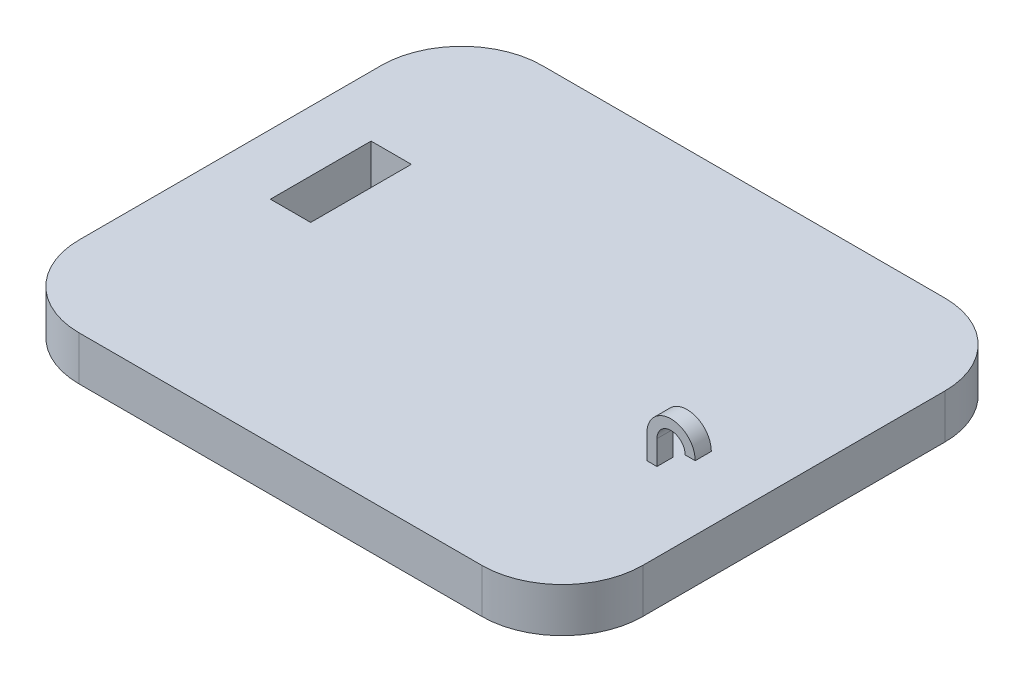
ISO-10303-21;
HEADER;
FILE_DESCRIPTION(('STEP AP214'),'2;1');
FILE_NAME('part.step','',(''),(''),'','','');
FILE_SCHEMA(('AUTOMOTIVE_DESIGN { 1 0 10303 214 1 1 1 1 }'));
ENDSEC;
DATA;
#1=APPLICATION_CONTEXT('core data for automotive mechanical design processes');
#2=APPLICATION_PROTOCOL_DEFINITION('international standard','automotive_design',2000,#1);
#3=PRODUCT_CONTEXT('',#1,'mechanical');
#4=PRODUCT('Part','Part','',(#3));
#5=PRODUCT_RELATED_PRODUCT_CATEGORY('part','',(#4));
#6=PRODUCT_DEFINITION_FORMATION('','',#4);
#7=PRODUCT_DEFINITION_CONTEXT('part definition',#1,'design');
#8=PRODUCT_DEFINITION('design','',#6,#7);
#9=PRODUCT_DEFINITION_SHAPE('','',#8);
#10=(LENGTH_UNIT() NAMED_UNIT(*) SI_UNIT(.MILLI.,.METRE.));
#11=(NAMED_UNIT(*) PLANE_ANGLE_UNIT() SI_UNIT($,.RADIAN.));
#12=(NAMED_UNIT(*) SI_UNIT($,.STERADIAN.) SOLID_ANGLE_UNIT());
#13=UNCERTAINTY_MEASURE_WITH_UNIT(LENGTH_MEASURE(1.E-05),#10,'distance_accuracy_value','');
#14=(GEOMETRIC_REPRESENTATION_CONTEXT(3) GLOBAL_UNCERTAINTY_ASSIGNED_CONTEXT((#13)) GLOBAL_UNIT_ASSIGNED_CONTEXT((#10,
#11,#12)) REPRESENTATION_CONTEXT('',''));
#15=CARTESIAN_POINT('',(0.,0.,0.));
#16=DIRECTION('',(0.,0.,1.));
#17=DIRECTION('',(1.,0.,0.));
#18=AXIS2_PLACEMENT_3D('',#15,#16,#17);
#19=CARTESIAN_POINT('',(-80.,-11.,-50.));
#20=DIRECTION('',(-1.,0.,0.));
#21=DIRECTION('',(0.,0.,1.));
#22=AXIS2_PLACEMENT_3D('',#19,#20,#21);
#23=PLANE('',#22);
#24=DIRECTION('',(0.,0.,1.));
#25=VECTOR('',#24,1.);
#26=CARTESIAN_POINT('',(-80.,0.,-50.));
#27=LINE('',#26,#25);
#28=CARTESIAN_POINT('',(-80.,0.,-30.));
#29=VERTEX_POINT('',#28);
#30=CARTESIAN_POINT('',(-80.,0.,45.));
#31=VERTEX_POINT('',#30);
#32=EDGE_CURVE('E234',#29,#31,#27,.T.);
#33=ORIENTED_EDGE('',*,*,#32,.F.);
#34=DIRECTION('',(0.,1.,0.));
#35=VECTOR('',#34,1.);
#36=CARTESIAN_POINT('',(-80.,-11.,-30.));
#37=LINE('',#36,#35);
#38=CARTESIAN_POINT('',(-80.,-11.,-30.));
#39=VERTEX_POINT('',#38);
#40=EDGE_CURVE('E314',#29,#39,#37,.F.);
#41=ORIENTED_EDGE('',*,*,#40,.T.);
#42=DIRECTION('',(0.,0.,1.));
#43=VECTOR('',#42,1.);
#44=CARTESIAN_POINT('',(-80.,-11.,-50.));
#45=LINE('',#44,#43);
#46=CARTESIAN_POINT('',(-80.,-11.,45.));
#47=VERTEX_POINT('',#46);
#48=EDGE_CURVE('E244',#39,#47,#45,.T.);
#49=ORIENTED_EDGE('',*,*,#48,.T.);
#50=DIRECTION('',(0.,1.,0.));
#51=VECTOR('',#50,1.);
#52=CARTESIAN_POINT('',(-80.,-11.,45.));
#53=LINE('',#52,#51);
#54=EDGE_CURVE('E310',#47,#31,#53,.T.);
#55=ORIENTED_EDGE('',*,*,#54,.T.);
#56=EDGE_LOOP('',(#33,#41,#49,#55));
#57=FACE_BOUND('',#56,.T.);
#58=ADVANCED_FACE('F39',(#57),#23,.T.);
#59=CARTESIAN_POINT('',(-80.,-11.,-50.));
#60=DIRECTION('',(0.,0.,1.));
#61=DIRECTION('',(1.,0.,0.));
#62=AXIS2_PLACEMENT_3D('',#59,#60,#61);
#63=PLANE('',#62);
#64=DIRECTION('',(1.,0.,0.));
#65=VECTOR('',#64,1.);
#66=CARTESIAN_POINT('',(-80.,0.,-50.));
#67=LINE('',#66,#65);
#68=CARTESIAN_POINT('',(-60.,0.,-50.));
#69=VERTEX_POINT('',#68);
#70=CARTESIAN_POINT('',(40.,0.,-50.));
#71=VERTEX_POINT('',#70);
#72=EDGE_CURVE('E249',#69,#71,#67,.T.);
#73=ORIENTED_EDGE('',*,*,#72,.T.);
#74=DIRECTION('',(0.,1.,0.));
#75=VECTOR('',#74,1.);
#76=CARTESIAN_POINT('',(40.,-11.,-50.));
#77=LINE('',#76,#75);
#78=CARTESIAN_POINT('',(40.,-11.,-50.));
#79=VERTEX_POINT('',#78);
#80=EDGE_CURVE('E296',#71,#79,#77,.F.);
#81=ORIENTED_EDGE('',*,*,#80,.T.);
#82=DIRECTION('',(1.,0.,0.));
#83=VECTOR('',#82,1.);
#84=CARTESIAN_POINT('',(-80.,-11.,-50.));
#85=LINE('',#84,#83);
#86=CARTESIAN_POINT('',(-60.,-11.,-50.));
#87=VERTEX_POINT('',#86);
#88=EDGE_CURVE('E255',#87,#79,#85,.T.);
#89=ORIENTED_EDGE('',*,*,#88,.F.);
#90=DIRECTION('',(0.,1.,0.));
#91=VECTOR('',#90,1.);
#92=CARTESIAN_POINT('',(-60.,0.,-50.));
#93=LINE('',#92,#91);
#94=EDGE_CURVE('E292',#87,#69,#93,.T.);
#95=ORIENTED_EDGE('',*,*,#94,.T.);
#96=EDGE_LOOP('',(#73,#81,#89,#95));
#97=FACE_BOUND('',#96,.T.);
#98=ADVANCED_FACE('F343',(#97),#63,.F.);
#99=CARTESIAN_POINT('',(60.,-11.,-50.));
#100=DIRECTION('',(-1.,0.,0.));
#101=DIRECTION('',(0.,0.,1.));
#102=AXIS2_PLACEMENT_3D('',#99,#100,#101);
#103=PLANE('',#102);
#104=DIRECTION('',(0.,0.,1.));
#105=VECTOR('',#104,1.);
#106=CARTESIAN_POINT('',(60.,-11.,-50.));
#107=LINE('',#106,#105);
#108=CARTESIAN_POINT('',(60.,-11.,-30.));
#109=VERTEX_POINT('',#108);
#110=CARTESIAN_POINT('',(60.,-11.,45.));
#111=VERTEX_POINT('',#110);
#112=EDGE_CURVE('E252',#109,#111,#107,.T.);
#113=ORIENTED_EDGE('',*,*,#112,.F.);
#114=DIRECTION('',(0.,1.,0.));
#115=VECTOR('',#114,1.);
#116=CARTESIAN_POINT('',(60.,-11.,-30.));
#117=LINE('',#116,#115);
#118=CARTESIAN_POINT('',(60.,0.,-30.));
#119=VERTEX_POINT('',#118);
#120=EDGE_CURVE('E276',#109,#119,#117,.T.);
#121=ORIENTED_EDGE('',*,*,#120,.T.);
#122=DIRECTION('',(0.,0.,1.));
#123=VECTOR('',#122,1.);
#124=CARTESIAN_POINT('',(60.,0.,-50.));
#125=LINE('',#124,#123);
#126=CARTESIAN_POINT('',(60.,0.,45.));
#127=VERTEX_POINT('',#126);
#128=EDGE_CURVE('E267',#119,#127,#125,.T.);
#129=ORIENTED_EDGE('',*,*,#128,.T.);
#130=DIRECTION('',(0.,1.,0.));
#131=VECTOR('',#130,1.);
#132=CARTESIAN_POINT('',(60.,-11.,45.));
#133=LINE('',#132,#131);
#134=EDGE_CURVE('E259',#127,#111,#133,.F.);
#135=ORIENTED_EDGE('',*,*,#134,.T.);
#136=EDGE_LOOP('',(#113,#121,#129,#135));
#137=FACE_BOUND('',#136,.T.);
#138=ADVANCED_FACE('F351',(#137),#103,.F.);
#139=CARTESIAN_POINT('',(-80.,-11.,65.));
#140=DIRECTION('',(0.,0.,1.));
#141=DIRECTION('',(1.,0.,0.));
#142=AXIS2_PLACEMENT_3D('',#139,#140,#141);
#143=PLANE('',#142);
#144=DIRECTION('',(1.,0.,0.));
#145=VECTOR('',#144,1.);
#146=CARTESIAN_POINT('',(-80.,0.,65.));
#147=LINE('',#146,#145);
#148=CARTESIAN_POINT('',(-60.,0.,65.));
#149=VERTEX_POINT('',#148);
#150=CARTESIAN_POINT('',(40.,0.,65.));
#151=VERTEX_POINT('',#150);
#152=EDGE_CURVE('E263',#149,#151,#147,.T.);
#153=ORIENTED_EDGE('',*,*,#152,.F.);
#154=DIRECTION('',(0.,1.,0.));
#155=VECTOR('',#154,1.);
#156=CARTESIAN_POINT('',(-60.,-11.,65.));
#157=LINE('',#156,#155);
#158=CARTESIAN_POINT('',(-60.,-11.,65.));
#159=VERTEX_POINT('',#158);
#160=EDGE_CURVE('E11',#149,#159,#157,.F.);
#161=ORIENTED_EDGE('',*,*,#160,.T.);
#162=DIRECTION('',(1.,0.,0.));
#163=VECTOR('',#162,1.);
#164=CARTESIAN_POINT('',(-80.,-11.,65.));
#165=LINE('',#164,#163);
#166=CARTESIAN_POINT('',(40.,-11.,65.));
#167=VERTEX_POINT('',#166);
#168=EDGE_CURVE('E248',#159,#167,#165,.T.);
#169=ORIENTED_EDGE('',*,*,#168,.T.);
#170=DIRECTION('',(0.,1.,0.));
#171=VECTOR('',#170,1.);
#172=CARTESIAN_POINT('',(40.,0.,65.));
#173=LINE('',#172,#171);
#174=EDGE_CURVE('E48',#167,#151,#173,.T.);
#175=ORIENTED_EDGE('',*,*,#174,.T.);
#176=EDGE_LOOP('',(#153,#161,#169,#175));
#177=FACE_BOUND('',#176,.T.);
#178=ADVANCED_FACE('F321',(#177),#143,.T.);
#179=CARTESIAN_POINT('',(0.,-11.,0.));
#180=DIRECTION('',(0.,1.,0.));
#181=DIRECTION('',(0.,0.,1.));
#182=AXIS2_PLACEMENT_3D('',#179,#180,#181);
#183=PLANE('',#182);
#184=DIRECTION('',(-1.,0.,0.));
#185=VECTOR('',#184,1.);
#186=CARTESIAN_POINT('',(-65.,-11.,-12.5));
#187=LINE('',#186,#185);
#188=CARTESIAN_POINT('',(-55.,-11.,-12.5));
#189=VERTEX_POINT('',#188);
#190=CARTESIAN_POINT('',(-65.,-11.,-12.5));
#191=VERTEX_POINT('',#190);
#192=EDGE_CURVE('E216',#189,#191,#187,.T.);
#193=ORIENTED_EDGE('',*,*,#192,.T.);
#194=DIRECTION('',(0.,0.,1.));
#195=VECTOR('',#194,1.);
#196=CARTESIAN_POINT('',(-65.,-11.,-12.5));
#197=LINE('',#196,#195);
#198=CARTESIAN_POINT('',(-65.,-11.,12.5));
#199=VERTEX_POINT('',#198);
#200=EDGE_CURVE('E203',#191,#199,#197,.T.);
#201=ORIENTED_EDGE('',*,*,#200,.T.);
#202=DIRECTION('',(1.,0.,0.));
#203=VECTOR('',#202,1.);
#204=CARTESIAN_POINT('',(-65.,-11.,12.5));
#205=LINE('',#204,#203);
#206=CARTESIAN_POINT('',(-55.,-11.,12.5));
#207=VERTEX_POINT('',#206);
#208=EDGE_CURVE('E207',#199,#207,#205,.T.);
#209=ORIENTED_EDGE('',*,*,#208,.T.);
#210=DIRECTION('',(0.,0.,-1.));
#211=VECTOR('',#210,1.);
#212=CARTESIAN_POINT('',(-55.,-11.,-12.5));
#213=LINE('',#212,#211);
#214=EDGE_CURVE('E212',#207,#189,#213,.T.);
#215=ORIENTED_EDGE('',*,*,#214,.T.);
#216=EDGE_LOOP('',(#193,#201,#209,#215));
#217=FACE_BOUND('',#216,.T.);
#218=ORIENTED_EDGE('',*,*,#88,.T.);
#219=CARTESIAN_POINT('',(40.,-11.,-30.));
#220=DIRECTION('',(0.,1.,0.));
#221=DIRECTION('',(0.,0.,1.));
#222=AXIS2_PLACEMENT_3D('',#219,#220,#221);
#223=CIRCLE('',#222,20.);
#224=EDGE_CURVE('E307',#79,#109,#223,.F.);
#225=ORIENTED_EDGE('',*,*,#224,.T.);
#226=ORIENTED_EDGE('',*,*,#112,.T.);
#227=CARTESIAN_POINT('',(40.,-11.,45.));
#228=DIRECTION('',(0.,1.,0.));
#229=DIRECTION('',(0.,0.,1.));
#230=AXIS2_PLACEMENT_3D('',#227,#228,#229);
#231=CIRCLE('',#230,20.);
#232=EDGE_CURVE('E63',#111,#167,#231,.F.);
#233=ORIENTED_EDGE('',*,*,#232,.T.);
#234=ORIENTED_EDGE('',*,*,#168,.F.);
#235=CARTESIAN_POINT('',(-60.,-11.,45.));
#236=DIRECTION('',(0.,1.,0.));
#237=DIRECTION('',(0.,0.,1.));
#238=AXIS2_PLACEMENT_3D('',#235,#236,#237);
#239=CIRCLE('',#238,20.);
#240=EDGE_CURVE('E301',#159,#47,#239,.F.);
#241=ORIENTED_EDGE('',*,*,#240,.T.);
#242=ORIENTED_EDGE('',*,*,#48,.F.);
#243=CARTESIAN_POINT('',(-60.,-11.,-30.));
#244=DIRECTION('',(0.,1.,0.));
#245=DIRECTION('',(0.,0.,1.));
#246=AXIS2_PLACEMENT_3D('',#243,#244,#245);
#247=CIRCLE('',#246,20.);
#248=EDGE_CURVE('E304',#39,#87,#247,.F.);
#249=ORIENTED_EDGE('',*,*,#248,.T.);
#250=EDGE_LOOP('',(#218,#225,#226,#233,#234,#241,#242,#249));
#251=FACE_BOUND('',#250,.T.);
#252=ADVANCED_FACE('F336',(#217,#251),#183,.F.);
#253=CARTESIAN_POINT('',(0.,0.,0.));
#254=DIRECTION('',(0.,1.,0.));
#255=DIRECTION('',(0.,0.,1.));
#256=AXIS2_PLACEMENT_3D('',#253,#254,#255);
#257=PLANE('',#256);
#258=DIRECTION('',(1.,0.,0.));
#259=VECTOR('',#258,1.);
#260=CARTESIAN_POINT('',(37.9999999999986,0.,22.));
#261=LINE('',#260,#259);
#262=CARTESIAN_POINT('',(37.9999999999986,0.,22.));
#263=VERTEX_POINT('',#262);
#264=CARTESIAN_POINT('',(40.4999999999989,0.,22.));
#265=VERTEX_POINT('',#264);
#266=EDGE_CURVE('E584',#263,#265,#261,.T.);
#267=ORIENTED_EDGE('',*,*,#266,.F.);
#268=DIRECTION('',(0.,0.,-1.));
#269=VECTOR('',#268,1.);
#270=CARTESIAN_POINT('',(37.9999999999986,0.,22.));
#271=LINE('',#270,#269);
#272=CARTESIAN_POINT('',(37.9999999999986,0.,18.));
#273=VERTEX_POINT('',#272);
#274=EDGE_CURVE('E572',#263,#273,#271,.T.);
#275=ORIENTED_EDGE('',*,*,#274,.T.);
#276=DIRECTION('',(1.,0.,0.));
#277=VECTOR('',#276,1.);
#278=CARTESIAN_POINT('',(37.9999999999986,0.,18.));
#279=LINE('',#278,#277);
#280=CARTESIAN_POINT('',(40.4999999999989,0.,18.));
#281=VERTEX_POINT('',#280);
#282=EDGE_CURVE('E560',#273,#281,#279,.T.);
#283=ORIENTED_EDGE('',*,*,#282,.T.);
#284=DIRECTION('',(0.,0.,-1.));
#285=VECTOR('',#284,1.);
#286=CARTESIAN_POINT('',(40.4999999999989,0.,22.));
#287=LINE('',#286,#285);
#288=EDGE_CURVE('E569',#265,#281,#287,.T.);
#289=ORIENTED_EDGE('',*,*,#288,.F.);
#290=EDGE_LOOP('',(#267,#275,#283,#289));
#291=FACE_BOUND('',#290,.T.);
#292=DIRECTION('',(0.,0.,1.));
#293=VECTOR('',#292,1.);
#294=CARTESIAN_POINT('',(-65.,0.,-12.5));
#295=LINE('',#294,#293);
#296=CARTESIAN_POINT('',(-65.,0.,-12.5));
#297=VERTEX_POINT('',#296);
#298=CARTESIAN_POINT('',(-65.,0.,12.5));
#299=VERTEX_POINT('',#298);
#300=EDGE_CURVE('E193',#297,#299,#295,.T.);
#301=ORIENTED_EDGE('',*,*,#300,.F.);
#302=DIRECTION('',(-1.,0.,0.));
#303=VECTOR('',#302,1.);
#304=CARTESIAN_POINT('',(-65.,0.,-12.5));
#305=LINE('',#304,#303);
#306=CARTESIAN_POINT('',(-55.,0.,-12.5));
#307=VERTEX_POINT('',#306);
#308=EDGE_CURVE('E208',#307,#297,#305,.T.);
#309=ORIENTED_EDGE('',*,*,#308,.F.);
#310=DIRECTION('',(0.,0.,-1.));
#311=VECTOR('',#310,1.);
#312=CARTESIAN_POINT('',(-55.,0.,-12.5));
#313=LINE('',#312,#311);
#314=CARTESIAN_POINT('',(-55.,0.,12.5));
#315=VERTEX_POINT('',#314);
#316=EDGE_CURVE('E224',#315,#307,#313,.T.);
#317=ORIENTED_EDGE('',*,*,#316,.F.);
#318=DIRECTION('',(1.,0.,0.));
#319=VECTOR('',#318,1.);
#320=CARTESIAN_POINT('',(-65.,0.,12.5));
#321=LINE('',#320,#319);
#322=EDGE_CURVE('E197',#299,#315,#321,.T.);
#323=ORIENTED_EDGE('',*,*,#322,.F.);
#324=EDGE_LOOP('',(#301,#309,#317,#323));
#325=FACE_BOUND('',#324,.T.);
#326=ORIENTED_EDGE('',*,*,#128,.F.);
#327=CARTESIAN_POINT('',(40.,0.,-30.));
#328=DIRECTION('',(0.,1.,0.));
#329=DIRECTION('',(0.,0.,1.));
#330=AXIS2_PLACEMENT_3D('',#327,#328,#329);
#331=CIRCLE('',#330,20.);
#332=EDGE_CURVE('E289',#119,#71,#331,.T.);
#333=ORIENTED_EDGE('',*,*,#332,.T.);
#334=ORIENTED_EDGE('',*,*,#72,.F.);
#335=CARTESIAN_POINT('',(-60.,0.,-30.));
#336=DIRECTION('',(0.,1.,0.));
#337=DIRECTION('',(0.,0.,1.));
#338=AXIS2_PLACEMENT_3D('',#335,#336,#337);
#339=CIRCLE('',#338,20.);
#340=EDGE_CURVE('E286',#69,#29,#339,.T.);
#341=ORIENTED_EDGE('',*,*,#340,.T.);
#342=ORIENTED_EDGE('',*,*,#32,.T.);
#343=CARTESIAN_POINT('',(-60.,0.,45.));
#344=DIRECTION('',(0.,1.,0.));
#345=DIRECTION('',(0.,0.,1.));
#346=AXIS2_PLACEMENT_3D('',#343,#344,#345);
#347=CIRCLE('',#346,20.);
#348=EDGE_CURVE('E283',#31,#149,#347,.T.);
#349=ORIENTED_EDGE('',*,*,#348,.T.);
#350=ORIENTED_EDGE('',*,*,#152,.T.);
#351=CARTESIAN_POINT('',(40.,0.,45.));
#352=DIRECTION('',(0.,1.,0.));
#353=DIRECTION('',(0.,0.,1.));
#354=AXIS2_PLACEMENT_3D('',#351,#352,#353);
#355=CIRCLE('',#354,20.);
#356=EDGE_CURVE('E280',#151,#127,#355,.T.);
#357=ORIENTED_EDGE('',*,*,#356,.T.);
#358=EDGE_LOOP('',(#326,#333,#334,#341,#342,#349,#350,#357));
#359=FACE_BOUND('',#358,.T.);
#360=ADVANCED_FACE('F326',(#291,#325,#359),#257,.T.);
#361=CARTESIAN_POINT('',(-65.,-11.,-12.5));
#362=DIRECTION('',(-1.,0.,0.));
#363=DIRECTION('',(0.,0.,1.));
#364=AXIS2_PLACEMENT_3D('',#361,#362,#363);
#365=PLANE('',#364);
#366=ORIENTED_EDGE('',*,*,#300,.T.);
#367=DIRECTION('',(0.,1.,0.));
#368=VECTOR('',#367,1.);
#369=CARTESIAN_POINT('',(-65.,-11.,12.5));
#370=LINE('',#369,#368);
#371=EDGE_CURVE('E219',#199,#299,#370,.T.);
#372=ORIENTED_EDGE('',*,*,#371,.F.);
#373=ORIENTED_EDGE('',*,*,#200,.F.);
#374=DIRECTION('',(0.,1.,0.));
#375=VECTOR('',#374,1.);
#376=CARTESIAN_POINT('',(-65.,-11.,-12.5));
#377=LINE('',#376,#375);
#378=EDGE_CURVE('E231',#191,#297,#377,.T.);
#379=ORIENTED_EDGE('',*,*,#378,.T.);
#380=EDGE_LOOP('',(#366,#372,#373,#379));
#381=FACE_BOUND('',#380,.T.);
#382=ADVANCED_FACE('F395',(#381),#365,.F.);
#383=CARTESIAN_POINT('',(-65.,-11.,-12.5));
#384=DIRECTION('',(0.,0.,-1.));
#385=DIRECTION('',(-1.,0.,0.));
#386=AXIS2_PLACEMENT_3D('',#383,#384,#385);
#387=PLANE('',#386);
#388=ORIENTED_EDGE('',*,*,#308,.T.);
#389=ORIENTED_EDGE('',*,*,#378,.F.);
#390=ORIENTED_EDGE('',*,*,#192,.F.);
#391=DIRECTION('',(0.,1.,0.));
#392=VECTOR('',#391,1.);
#393=CARTESIAN_POINT('',(-55.,-11.,-12.5));
#394=LINE('',#393,#392);
#395=EDGE_CURVE('E235',#189,#307,#394,.T.);
#396=ORIENTED_EDGE('',*,*,#395,.T.);
#397=EDGE_LOOP('',(#388,#389,#390,#396));
#398=FACE_BOUND('',#397,.T.);
#399=ADVANCED_FACE('F465',(#398),#387,.F.);
#400=CARTESIAN_POINT('',(-55.,-11.,-12.5));
#401=DIRECTION('',(1.,0.,0.));
#402=DIRECTION('',(0.,0.,-1.));
#403=AXIS2_PLACEMENT_3D('',#400,#401,#402);
#404=PLANE('',#403);
#405=ORIENTED_EDGE('',*,*,#316,.T.);
#406=ORIENTED_EDGE('',*,*,#395,.F.);
#407=ORIENTED_EDGE('',*,*,#214,.F.);
#408=DIRECTION('',(0.,1.,0.));
#409=VECTOR('',#408,1.);
#410=CARTESIAN_POINT('',(-55.,-11.,12.5));
#411=LINE('',#410,#409);
#412=EDGE_CURVE('E238',#207,#315,#411,.T.);
#413=ORIENTED_EDGE('',*,*,#412,.T.);
#414=EDGE_LOOP('',(#405,#406,#407,#413));
#415=FACE_BOUND('',#414,.T.);
#416=ADVANCED_FACE('F468',(#415),#404,.F.);
#417=CARTESIAN_POINT('',(-65.,-11.,12.5));
#418=DIRECTION('',(0.,0.,1.));
#419=DIRECTION('',(1.,0.,0.));
#420=AXIS2_PLACEMENT_3D('',#417,#418,#419);
#421=PLANE('',#420);
#422=ORIENTED_EDGE('',*,*,#322,.T.);
#423=ORIENTED_EDGE('',*,*,#412,.F.);
#424=ORIENTED_EDGE('',*,*,#208,.F.);
#425=ORIENTED_EDGE('',*,*,#371,.T.);
#426=EDGE_LOOP('',(#422,#423,#424,#425));
#427=FACE_BOUND('',#426,.T.);
#428=ADVANCED_FACE('F370',(#427),#421,.F.);
#429=CARTESIAN_POINT('',(40.,-11.,-30.));
#430=DIRECTION('',(0.,1.,0.));
#431=DIRECTION('',(0.,0.,1.));
#432=AXIS2_PLACEMENT_3D('',#429,#430,#431);
#433=CYLINDRICAL_SURFACE('',#432,20.);
#434=ORIENTED_EDGE('',*,*,#224,.F.);
#435=ORIENTED_EDGE('',*,*,#80,.F.);
#436=ORIENTED_EDGE('',*,*,#332,.F.);
#437=ORIENTED_EDGE('',*,*,#120,.F.);
#438=EDGE_LOOP('',(#434,#435,#436,#437));
#439=FACE_BOUND('',#438,.T.);
#440=ADVANCED_FACE('F348',(#439),#433,.T.);
#441=CARTESIAN_POINT('',(-60.,-11.,-30.));
#442=DIRECTION('',(0.,-1.,0.));
#443=DIRECTION('',(0.,0.,-1.));
#444=AXIS2_PLACEMENT_3D('',#441,#442,#443);
#445=CYLINDRICAL_SURFACE('',#444,20.);
#446=ORIENTED_EDGE('',*,*,#248,.F.);
#447=ORIENTED_EDGE('',*,*,#40,.F.);
#448=ORIENTED_EDGE('',*,*,#340,.F.);
#449=ORIENTED_EDGE('',*,*,#94,.F.);
#450=EDGE_LOOP('',(#446,#447,#448,#449));
#451=FACE_BOUND('',#450,.T.);
#452=ADVANCED_FACE('F340',(#451),#445,.T.);
#453=CARTESIAN_POINT('',(-60.,-11.,45.));
#454=DIRECTION('',(0.,1.,0.));
#455=DIRECTION('',(0.,0.,1.));
#456=AXIS2_PLACEMENT_3D('',#453,#454,#455);
#457=CYLINDRICAL_SURFACE('',#456,20.);
#458=ORIENTED_EDGE('',*,*,#240,.F.);
#459=ORIENTED_EDGE('',*,*,#160,.F.);
#460=ORIENTED_EDGE('',*,*,#348,.F.);
#461=ORIENTED_EDGE('',*,*,#54,.F.);
#462=EDGE_LOOP('',(#458,#459,#460,#461));
#463=FACE_BOUND('',#462,.T.);
#464=ADVANCED_FACE('F331',(#463),#457,.T.);
#465=CARTESIAN_POINT('',(40.,-11.,45.));
#466=DIRECTION('',(0.,-1.,0.));
#467=DIRECTION('',(0.,0.,-1.));
#468=AXIS2_PLACEMENT_3D('',#465,#466,#467);
#469=CYLINDRICAL_SURFACE('',#468,20.);
#470=ORIENTED_EDGE('',*,*,#232,.F.);
#471=ORIENTED_EDGE('',*,*,#134,.F.);
#472=ORIENTED_EDGE('',*,*,#356,.F.);
#473=ORIENTED_EDGE('',*,*,#174,.F.);
#474=EDGE_LOOP('',(#470,#471,#472,#473));
#475=FACE_BOUND('',#474,.T.);
#476=ADVANCED_FACE('F41',(#475),#469,.T.);
#477=CARTESIAN_POINT('',(43.9999999999993,6.0000000000008,22.));
#478=DIRECTION('',(0.,0.,-1.));
#479=DIRECTION('',(-1.,0.,0.));
#480=AXIS2_PLACEMENT_3D('',#477,#478,#479);
#481=CYLINDRICAL_SURFACE('',#480,3.50000000000043);
#482=CARTESIAN_POINT('',(43.9999999999993,6.0000000000008,18.));
#483=DIRECTION('',(0.,0.,-1.));
#484=DIRECTION('',(1.,0.,0.));
#485=AXIS2_PLACEMENT_3D('',#482,#483,#484);
#486=CIRCLE('',#485,3.50000000000043);
#487=CARTESIAN_POINT('',(40.4999999999989,6.0000000000008,18.));
#488=VERTEX_POINT('',#487);
#489=CARTESIAN_POINT('',(47.4999999999997,6.0000000000008,18.));
#490=VERTEX_POINT('',#489);
#491=EDGE_CURVE('E191',#488,#490,#486,.T.);
#492=ORIENTED_EDGE('',*,*,#491,.T.);
#493=DIRECTION('',(0.,0.,-1.));
#494=VECTOR('',#493,1.);
#495=CARTESIAN_POINT('',(47.4999999999997,6.0000000000008,22.));
#496=LINE('',#495,#494);
#497=CARTESIAN_POINT('',(47.4999999999997,6.0000000000008,22.));
#498=VERTEX_POINT('',#497);
#499=EDGE_CURVE('E171',#498,#490,#496,.T.);
#500=ORIENTED_EDGE('',*,*,#499,.F.);
#501=CARTESIAN_POINT('',(43.9999999999993,6.0000000000008,22.));
#502=DIRECTION('',(0.,0.,-1.));
#503=DIRECTION('',(1.,0.,0.));
#504=AXIS2_PLACEMENT_3D('',#501,#502,#503);
#505=CIRCLE('',#504,3.50000000000043);
#506=CARTESIAN_POINT('',(40.4999999999989,6.0000000000008,22.));
#507=VERTEX_POINT('',#506);
#508=EDGE_CURVE('E179',#507,#498,#505,.T.);
#509=ORIENTED_EDGE('',*,*,#508,.F.);
#510=DIRECTION('',(0.,0.,-1.));
#511=VECTOR('',#510,1.);
#512=CARTESIAN_POINT('',(40.4999999999989,6.0000000000008,22.));
#513=LINE('',#512,#511);
#514=EDGE_CURVE('E566',#507,#488,#513,.T.);
#515=ORIENTED_EDGE('',*,*,#514,.T.);
#516=EDGE_LOOP('',(#492,#500,#509,#515));
#517=FACE_BOUND('',#516,.T.);
#518=ADVANCED_FACE('F190',(#517),#481,.F.);
#519=CARTESIAN_POINT('',(47.4999999999997,6.0000000000008,22.));
#520=DIRECTION('',(0.,1.,0.));
#521=DIRECTION('',(0.,0.,1.));
#522=AXIS2_PLACEMENT_3D('',#519,#520,#521);
#523=PLANE('',#522);
#524=DIRECTION('',(1.,0.,0.));
#525=VECTOR('',#524,1.);
#526=CARTESIAN_POINT('',(47.4999999999997,6.0000000000008,18.));
#527=LINE('',#526,#525);
#528=CARTESIAN_POINT('',(50.,6.0000000000008,18.));
#529=VERTEX_POINT('',#528);
#530=EDGE_CURVE('E546',#490,#529,#527,.T.);
#531=ORIENTED_EDGE('',*,*,#530,.T.);
#532=DIRECTION('',(0.,0.,-1.));
#533=VECTOR('',#532,1.);
#534=CARTESIAN_POINT('',(50.,6.0000000000008,22.));
#535=LINE('',#534,#533);
#536=CARTESIAN_POINT('',(50.,6.0000000000008,22.));
#537=VERTEX_POINT('',#536);
#538=EDGE_CURVE('E174',#537,#529,#535,.T.);
#539=ORIENTED_EDGE('',*,*,#538,.F.);
#540=DIRECTION('',(1.,0.,0.));
#541=VECTOR('',#540,1.);
#542=CARTESIAN_POINT('',(47.4999999999997,6.0000000000008,22.));
#543=LINE('',#542,#541);
#544=EDGE_CURVE('E167',#498,#537,#543,.T.);
#545=ORIENTED_EDGE('',*,*,#544,.F.);
#546=ORIENTED_EDGE('',*,*,#499,.T.);
#547=EDGE_LOOP('',(#531,#539,#545,#546));
#548=FACE_BOUND('',#547,.T.);
#549=ADVANCED_FACE('F169',(#548),#523,.F.);
#550=CARTESIAN_POINT('',(43.9999999999993,6.0000000000008,22.));
#551=DIRECTION('',(0.,0.,-1.));
#552=DIRECTION('',(-1.,0.,0.));
#553=AXIS2_PLACEMENT_3D('',#550,#551,#552);
#554=CYLINDRICAL_SURFACE('',#553,6.00000000000071);
#555=CARTESIAN_POINT('',(43.9999999999993,6.0000000000008,18.));
#556=DIRECTION('',(0.,0.,1.));
#557=DIRECTION('',(1.,0.,0.));
#558=AXIS2_PLACEMENT_3D('',#555,#556,#557);
#559=CIRCLE('',#558,6.00000000000071);
#560=CARTESIAN_POINT('',(37.9999999999986,6.0000000000008,18.));
#561=VERTEX_POINT('',#560);
#562=EDGE_CURVE('E550',#529,#561,#559,.T.);
#563=ORIENTED_EDGE('',*,*,#562,.T.);
#564=DIRECTION('',(0.,0.,-1.));
#565=VECTOR('',#564,1.);
#566=CARTESIAN_POINT('',(37.9999999999986,6.0000000000008,22.));
#567=LINE('',#566,#565);
#568=CARTESIAN_POINT('',(37.9999999999986,6.0000000000008,22.));
#569=VERTEX_POINT('',#568);
#570=EDGE_CURVE('E199',#569,#561,#567,.T.);
#571=ORIENTED_EDGE('',*,*,#570,.F.);
#572=CARTESIAN_POINT('',(43.9999999999993,6.0000000000008,22.));
#573=DIRECTION('',(0.,0.,1.));
#574=DIRECTION('',(1.,0.,0.));
#575=AXIS2_PLACEMENT_3D('',#572,#573,#574);
#576=CIRCLE('',#575,6.00000000000071);
#577=EDGE_CURVE('E178',#537,#569,#576,.T.);
#578=ORIENTED_EDGE('',*,*,#577,.F.);
#579=ORIENTED_EDGE('',*,*,#538,.T.);
#580=EDGE_LOOP('',(#563,#571,#578,#579));
#581=FACE_BOUND('',#580,.T.);
#582=ADVANCED_FACE('F414',(#581),#554,.T.);
#583=CARTESIAN_POINT('',(37.9999999999986,6.0000000000008,22.));
#584=DIRECTION('',(1.,0.,0.));
#585=DIRECTION('',(0.,0.,-1.));
#586=AXIS2_PLACEMENT_3D('',#583,#584,#585);
#587=PLANE('',#586);
#588=DIRECTION('',(0.,-1.,0.));
#589=VECTOR('',#588,1.);
#590=CARTESIAN_POINT('',(37.9999999999986,6.0000000000008,18.));
#591=LINE('',#590,#589);
#592=EDGE_CURVE('E557',#561,#273,#591,.T.);
#593=ORIENTED_EDGE('',*,*,#592,.T.);
#594=ORIENTED_EDGE('',*,*,#274,.F.);
#595=DIRECTION('',(0.,-1.,0.));
#596=VECTOR('',#595,1.);
#597=CARTESIAN_POINT('',(37.9999999999986,6.0000000000008,22.));
#598=LINE('',#597,#596);
#599=EDGE_CURVE('E581',#569,#263,#598,.T.);
#600=ORIENTED_EDGE('',*,*,#599,.F.);
#601=ORIENTED_EDGE('',*,*,#570,.T.);
#602=EDGE_LOOP('',(#593,#594,#600,#601));
#603=FACE_BOUND('',#602,.T.);
#604=ADVANCED_FACE('F423',(#603),#587,.F.);
#605=CARTESIAN_POINT('',(40.4999999999989,6.0000000000008,22.));
#606=DIRECTION('',(-1.,0.,0.));
#607=DIRECTION('',(0.,0.,1.));
#608=AXIS2_PLACEMENT_3D('',#605,#606,#607);
#609=PLANE('',#608);
#610=DIRECTION('',(0.,1.,0.));
#611=VECTOR('',#610,1.);
#612=CARTESIAN_POINT('',(40.4999999999989,6.0000000000008,18.));
#613=LINE('',#612,#611);
#614=EDGE_CURVE('E55',#281,#488,#613,.T.);
#615=ORIENTED_EDGE('',*,*,#614,.T.);
#616=ORIENTED_EDGE('',*,*,#514,.F.);
#617=DIRECTION('',(0.,1.,0.));
#618=VECTOR('',#617,1.);
#619=CARTESIAN_POINT('',(40.4999999999989,6.0000000000008,22.));
#620=LINE('',#619,#618);
#621=EDGE_CURVE('E184',#265,#507,#620,.T.);
#622=ORIENTED_EDGE('',*,*,#621,.F.);
#623=ORIENTED_EDGE('',*,*,#288,.T.);
#624=EDGE_LOOP('',(#615,#616,#622,#623));
#625=FACE_BOUND('',#624,.T.);
#626=ADVANCED_FACE('F433',(#625),#609,.F.);
#627=CARTESIAN_POINT('',(43.9999999999993,6.0000000000008,22.));
#628=DIRECTION('',(0.,0.,1.));
#629=DIRECTION('',(1.,0.,0.));
#630=AXIS2_PLACEMENT_3D('',#627,#628,#629);
#631=PLANE('',#630);
#632=ORIENTED_EDGE('',*,*,#508,.T.);
#633=ORIENTED_EDGE('',*,*,#544,.T.);
#634=ORIENTED_EDGE('',*,*,#577,.T.);
#635=ORIENTED_EDGE('',*,*,#599,.T.);
#636=ORIENTED_EDGE('',*,*,#266,.T.);
#637=ORIENTED_EDGE('',*,*,#621,.T.);
#638=EDGE_LOOP('',(#632,#633,#634,#635,#636,#637));
#639=FACE_BOUND('',#638,.T.);
#640=ADVANCED_FACE('F182',(#639),#631,.T.);
#641=CARTESIAN_POINT('',(43.9999999999993,6.0000000000008,18.));
#642=DIRECTION('',(0.,0.,1.));
#643=DIRECTION('',(1.,0.,0.));
#644=AXIS2_PLACEMENT_3D('',#641,#642,#643);
#645=PLANE('',#644);
#646=ORIENTED_EDGE('',*,*,#491,.F.);
#647=ORIENTED_EDGE('',*,*,#614,.F.);
#648=ORIENTED_EDGE('',*,*,#282,.F.);
#649=ORIENTED_EDGE('',*,*,#592,.F.);
#650=ORIENTED_EDGE('',*,*,#562,.F.);
#651=ORIENTED_EDGE('',*,*,#530,.F.);
#652=EDGE_LOOP('',(#646,#647,#648,#649,#650,#651));
#653=FACE_BOUND('',#652,.T.);
#654=ADVANCED_FACE('F452',(#653),#645,.F.);
#655=CLOSED_SHELL('',(#58,#98,#138,#178,#252,#360,#382,#399,#416,#428,#440,#452,#464,#476,#518,
#549,#582,#604,#626,#640,#654));
#656=MANIFOLD_SOLID_BREP('B2',#655);
#657=ADVANCED_BREP_SHAPE_REPRESENTATION('',(#18,#656),#14);
#658=SHAPE_DEFINITION_REPRESENTATION(#9,#657);
ENDSEC;
END-ISO-10303-21;
